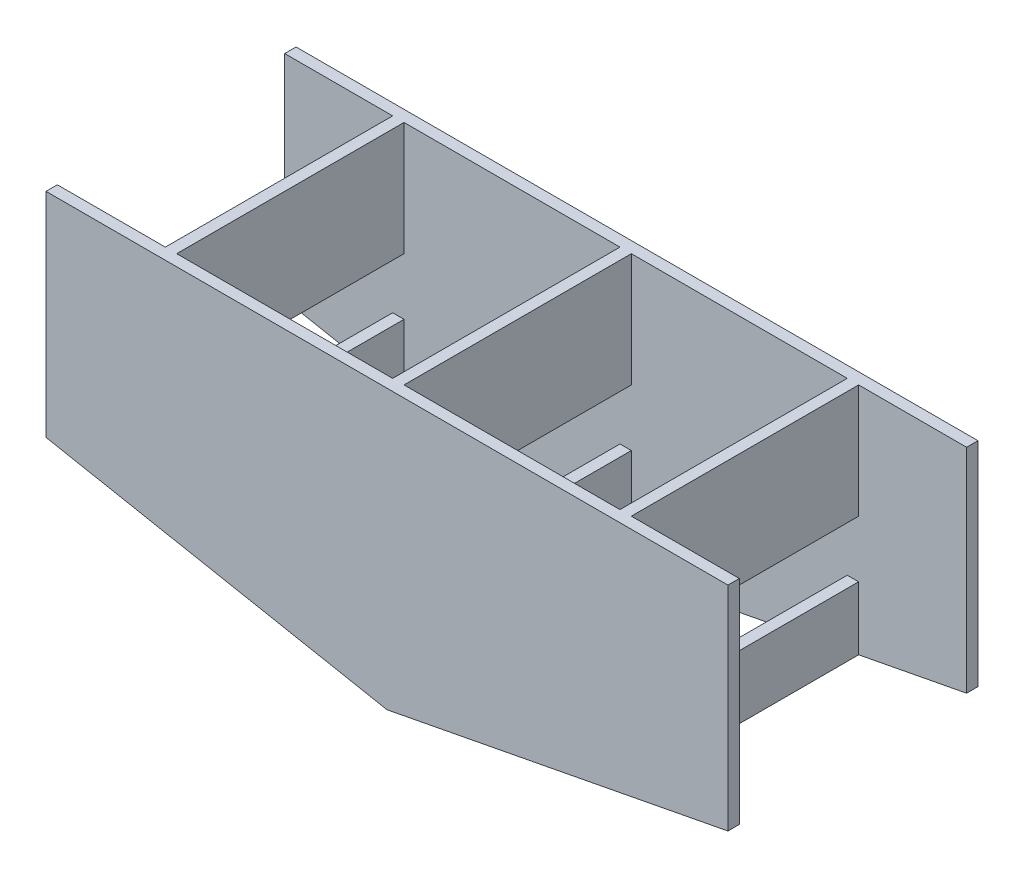
ISO-10303-21;
HEADER;
FILE_DESCRIPTION(('STEP AP214'),'2;1');
FILE_NAME('part.step','',(''),(''),'','','');
FILE_SCHEMA(('AUTOMOTIVE_DESIGN { 1 0 10303 214 1 1 1 1 }'));
ENDSEC;
DATA;
#1=APPLICATION_CONTEXT('core data for automotive mechanical design processes');
#2=APPLICATION_PROTOCOL_DEFINITION('international standard','automotive_design',2000,#1);
#3=PRODUCT_CONTEXT('',#1,'mechanical');
#4=PRODUCT('Part','Part','',(#3));
#5=PRODUCT_RELATED_PRODUCT_CATEGORY('part','',(#4));
#6=PRODUCT_DEFINITION_FORMATION('','',#4);
#7=PRODUCT_DEFINITION_CONTEXT('part definition',#1,'design');
#8=PRODUCT_DEFINITION('design','',#6,#7);
#9=PRODUCT_DEFINITION_SHAPE('','',#8);
#10=(LENGTH_UNIT() NAMED_UNIT(*) SI_UNIT(.MILLI.,.METRE.));
#11=(NAMED_UNIT(*) PLANE_ANGLE_UNIT() SI_UNIT($,.RADIAN.));
#12=(NAMED_UNIT(*) SI_UNIT($,.STERADIAN.) SOLID_ANGLE_UNIT());
#13=UNCERTAINTY_MEASURE_WITH_UNIT(LENGTH_MEASURE(1.E-05),#10,'distance_accuracy_value','');
#14=(GEOMETRIC_REPRESENTATION_CONTEXT(3) GLOBAL_UNCERTAINTY_ASSIGNED_CONTEXT((#13)) GLOBAL_UNIT_ASSIGNED_CONTEXT((#10,
#11,#12)) REPRESENTATION_CONTEXT('',''));
#15=CARTESIAN_POINT('',(0.,0.,0.));
#16=DIRECTION('',(0.,0.,1.));
#17=DIRECTION('',(1.,0.,0.));
#18=AXIS2_PLACEMENT_3D('',#15,#16,#17);
#19=CARTESIAN_POINT('',(152.4,-32.976439839216,-111.76));
#20=DIRECTION('',(1.,0.,0.));
#21=DIRECTION('',(0.,0.,-1.));
#22=AXIS2_PLACEMENT_3D('',#19,#20,#21);
#23=PLANE('',#22);
#24=DIRECTION('',(0.,1.,0.));
#25=VECTOR('',#24,1.);
#26=CARTESIAN_POINT('',(152.4,11.43,-106.68));
#27=LINE('',#26,#25);
#28=CARTESIAN_POINT('',(152.4,-32.976439839216,-106.68));
#29=VERTEX_POINT('',#28);
#30=CARTESIAN_POINT('',(152.4,62.23,-106.68));
#31=VERTEX_POINT('',#30);
#32=EDGE_CURVE('E374',#29,#31,#27,.T.);
#33=ORIENTED_EDGE('',*,*,#32,.F.);
#34=DIRECTION('',(0.,0.,1.));
#35=VECTOR('',#34,1.);
#36=CARTESIAN_POINT('',(152.4,-32.976439839216,-111.76));
#37=LINE('',#36,#35);
#38=CARTESIAN_POINT('',(152.4,-32.976439839216,-111.76));
#39=VERTEX_POINT('',#38);
#40=EDGE_CURVE('E424',#39,#29,#37,.T.);
#41=ORIENTED_EDGE('',*,*,#40,.F.);
#42=DIRECTION('',(0.,1.,0.));
#43=VECTOR('',#42,1.);
#44=CARTESIAN_POINT('',(152.4,-32.976439839216,-111.76));
#45=LINE('',#44,#43);
#46=CARTESIAN_POINT('',(152.4,62.23,-111.76));
#47=VERTEX_POINT('',#46);
#48=EDGE_CURVE('E406',#39,#47,#45,.T.);
#49=ORIENTED_EDGE('',*,*,#48,.T.);
#50=DIRECTION('',(0.,0.,1.));
#51=VECTOR('',#50,1.);
#52=CARTESIAN_POINT('',(152.4,62.23,-111.76));
#53=LINE('',#52,#51);
#54=EDGE_CURVE('E11',#47,#31,#53,.T.);
#55=ORIENTED_EDGE('',*,*,#54,.T.);
#56=EDGE_LOOP('',(#33,#41,#49,#55));
#57=FACE_BOUND('',#56,.T.);
#58=ADVANCED_FACE('F32',(#57),#23,.T.);
#59=CARTESIAN_POINT('',(-152.4,62.23,-111.76));
#60=DIRECTION('',(-1.,0.,0.));
#61=DIRECTION('',(0.,0.,1.));
#62=AXIS2_PLACEMENT_3D('',#59,#60,#61);
#63=PLANE('',#62);
#64=DIRECTION('',(0.,-1.,0.));
#65=VECTOR('',#64,1.);
#66=CARTESIAN_POINT('',(-152.4,11.43,-5.08));
#67=LINE('',#66,#65);
#68=CARTESIAN_POINT('',(-152.4,62.23,-5.07999999999999));
#69=VERTEX_POINT('',#68);
#70=CARTESIAN_POINT('',(-152.4,-33.02,-5.07999999999999));
#71=VERTEX_POINT('',#70);
#72=EDGE_CURVE('E365',#69,#71,#67,.T.);
#73=ORIENTED_EDGE('',*,*,#72,.T.);
#74=DIRECTION('',(0.,0.,1.));
#75=VECTOR('',#74,1.);
#76=CARTESIAN_POINT('',(-152.4,-33.02,-111.76));
#77=LINE('',#76,#75);
#78=CARTESIAN_POINT('',(-152.4,-33.02,0.));
#79=VERTEX_POINT('',#78);
#80=EDGE_CURVE('E431',#71,#79,#77,.T.);
#81=ORIENTED_EDGE('',*,*,#80,.T.);
#82=DIRECTION('',(0.,-1.,0.));
#83=VECTOR('',#82,1.);
#84=CARTESIAN_POINT('',(-152.4,62.23,0.));
#85=LINE('',#84,#83);
#86=CARTESIAN_POINT('',(-152.4,62.23,0.));
#87=VERTEX_POINT('',#86);
#88=EDGE_CURVE('E413',#87,#79,#85,.T.);
#89=ORIENTED_EDGE('',*,*,#88,.F.);
#90=DIRECTION('',(0.,0.,1.));
#91=VECTOR('',#90,1.);
#92=CARTESIAN_POINT('',(-152.4,62.23,-111.76));
#93=LINE('',#92,#91);
#94=EDGE_CURVE('E409',#69,#87,#93,.T.);
#95=ORIENTED_EDGE('',*,*,#94,.F.);
#96=EDGE_LOOP('',(#73,#81,#89,#95));
#97=FACE_BOUND('',#96,.T.);
#98=ADVANCED_FACE('F447',(#97),#63,.T.);
#99=CARTESIAN_POINT('',(-152.4,11.43,-106.68));
#100=DIRECTION('',(0.,1.,0.));
#101=DIRECTION('',(0.,0.,1.));
#102=AXIS2_PLACEMENT_3D('',#99,#100,#101);
#103=PLANE('',#102);
#104=DIRECTION('',(-1.,0.,0.));
#105=VECTOR('',#104,1.);
#106=CARTESIAN_POINT('',(-152.4,11.43,-106.68));
#107=LINE('',#106,#105);
#108=CARTESIAN_POINT('',(2.54000000000011,11.43,-106.68));
#109=VERTEX_POINT('',#108);
#110=CARTESIAN_POINT('',(-2.54,11.43,-106.68));
#111=VERTEX_POINT('',#110);
#112=EDGE_CURVE('E379',#109,#111,#107,.T.);
#113=ORIENTED_EDGE('',*,*,#112,.F.);
#114=DIRECTION('',(0.,0.,1.));
#115=VECTOR('',#114,1.);
#116=CARTESIAN_POINT('',(2.54000000000013,11.43,-106.68));
#117=LINE('',#116,#115);
#118=CARTESIAN_POINT('',(2.54000000000001,11.43,-5.08));
#119=VERTEX_POINT('',#118);
#120=EDGE_CURVE('E307',#109,#119,#117,.T.);
#121=ORIENTED_EDGE('',*,*,#120,.T.);
#122=DIRECTION('',(-1.,0.,0.));
#123=VECTOR('',#122,1.);
#124=CARTESIAN_POINT('',(-152.4,11.43,-5.08));
#125=LINE('',#124,#123);
#126=CARTESIAN_POINT('',(-2.54,11.43,-5.08));
#127=VERTEX_POINT('',#126);
#128=EDGE_CURVE('E392',#119,#127,#125,.T.);
#129=ORIENTED_EDGE('',*,*,#128,.T.);
#130=DIRECTION('',(0.,0.,-1.));
#131=VECTOR('',#130,1.);
#132=CARTESIAN_POINT('',(-2.54000000000001,11.43,-106.68));
#133=LINE('',#132,#131);
#134=EDGE_CURVE('E286',#127,#111,#133,.T.);
#135=ORIENTED_EDGE('',*,*,#134,.T.);
#136=EDGE_LOOP('',(#113,#121,#129,#135));
#137=FACE_BOUND('',#136,.T.);
#138=ADVANCED_FACE('F560',(#137),#103,.F.);
#139=CARTESIAN_POINT('',(104.14,11.43,-106.68));
#140=VERTEX_POINT('',#139);
#141=CARTESIAN_POINT('',(99.0600000000001,11.43,-106.68));
#142=VERTEX_POINT('',#141);
#143=EDGE_CURVE('E380',#140,#142,#107,.T.);
#144=ORIENTED_EDGE('',*,*,#143,.F.);
#145=DIRECTION('',(0.,0.,1.));
#146=VECTOR('',#145,1.);
#147=CARTESIAN_POINT('',(104.14,11.43,-106.68));
#148=LINE('',#147,#146);
#149=CARTESIAN_POINT('',(104.14,11.43,-5.07999999999989));
#150=VERTEX_POINT('',#149);
#151=EDGE_CURVE('E327',#140,#150,#148,.T.);
#152=ORIENTED_EDGE('',*,*,#151,.T.);
#153=CARTESIAN_POINT('',(99.0599999999999,11.43,-5.08));
#154=VERTEX_POINT('',#153);
#155=EDGE_CURVE('E369',#150,#154,#125,.T.);
#156=ORIENTED_EDGE('',*,*,#155,.T.);
#157=DIRECTION('',(0.,0.,-1.));
#158=VECTOR('',#157,1.);
#159=CARTESIAN_POINT('',(99.0600000000001,11.43,-106.68));
#160=LINE('',#159,#158);
#161=EDGE_CURVE('E296',#154,#142,#160,.T.);
#162=ORIENTED_EDGE('',*,*,#161,.T.);
#163=EDGE_LOOP('',(#144,#152,#156,#162));
#164=FACE_BOUND('',#163,.T.);
#165=ADVANCED_FACE('F555',(#164),#103,.F.);
#166=CARTESIAN_POINT('',(-152.4,-13.97,-106.68));
#167=DIRECTION('',(0.,-1.,0.));
#168=DIRECTION('',(0.,0.,-1.));
#169=AXIS2_PLACEMENT_3D('',#166,#167,#168);
#170=PLANE('',#169);
#171=DIRECTION('',(1.,0.,0.));
#172=VECTOR('',#171,1.);
#173=CARTESIAN_POINT('',(-152.4,-13.97,-5.08));
#174=LINE('',#173,#172);
#175=CARTESIAN_POINT('',(-2.54,-13.97,-5.08));
#176=VERTEX_POINT('',#175);
#177=CARTESIAN_POINT('',(2.53999999999996,-13.97,-5.08));
#178=VERTEX_POINT('',#177);
#179=EDGE_CURVE('E385',#176,#178,#174,.T.);
#180=ORIENTED_EDGE('',*,*,#179,.T.);
#181=DIRECTION('',(0.,0.,-1.));
#182=VECTOR('',#181,1.);
#183=CARTESIAN_POINT('',(2.54000000000013,-13.97,-106.68));
#184=LINE('',#183,#182);
#185=CARTESIAN_POINT('',(2.54000000000011,-13.97,-106.68));
#186=VERTEX_POINT('',#185);
#187=EDGE_CURVE('E304',#178,#186,#184,.T.);
#188=ORIENTED_EDGE('',*,*,#187,.T.);
#189=DIRECTION('',(1.,0.,0.));
#190=VECTOR('',#189,1.);
#191=CARTESIAN_POINT('',(-152.4,-13.97,-106.68));
#192=LINE('',#191,#190);
#193=CARTESIAN_POINT('',(-2.54000000000007,-13.97,-106.68));
#194=VERTEX_POINT('',#193);
#195=EDGE_CURVE('E372',#194,#186,#192,.T.);
#196=ORIENTED_EDGE('',*,*,#195,.F.);
#197=DIRECTION('',(0.,0.,1.));
#198=VECTOR('',#197,1.);
#199=CARTESIAN_POINT('',(-2.54000000000001,-13.97,-106.68));
#200=LINE('',#199,#198);
#201=EDGE_CURVE('E278',#194,#176,#200,.T.);
#202=ORIENTED_EDGE('',*,*,#201,.T.);
#203=EDGE_LOOP('',(#180,#188,#196,#202));
#204=FACE_BOUND('',#203,.T.);
#205=ADVANCED_FACE('F488',(#204),#170,.F.);
#206=CARTESIAN_POINT('',(99.06,-13.97,-5.07999999999989));
#207=VERTEX_POINT('',#206);
#208=CARTESIAN_POINT('',(104.14,-13.97,-5.08));
#209=VERTEX_POINT('',#208);
#210=EDGE_CURVE('E382',#207,#209,#174,.T.);
#211=ORIENTED_EDGE('',*,*,#210,.T.);
#212=DIRECTION('',(0.,0.,-1.));
#213=VECTOR('',#212,1.);
#214=CARTESIAN_POINT('',(104.14,-13.97,-106.68));
#215=LINE('',#214,#213);
#216=CARTESIAN_POINT('',(104.14,-13.97,-106.68));
#217=VERTEX_POINT('',#216);
#218=EDGE_CURVE('E324',#209,#217,#215,.T.);
#219=ORIENTED_EDGE('',*,*,#218,.T.);
#220=CARTESIAN_POINT('',(99.0600000000001,-13.97,-106.68));
#221=VERTEX_POINT('',#220);
#222=EDGE_CURVE('E368',#221,#217,#192,.T.);
#223=ORIENTED_EDGE('',*,*,#222,.F.);
#224=DIRECTION('',(0.,0.,1.));
#225=VECTOR('',#224,1.);
#226=CARTESIAN_POINT('',(99.0600000000001,-13.97,-106.68));
#227=LINE('',#226,#225);
#228=EDGE_CURVE('E293',#221,#207,#227,.T.);
#229=ORIENTED_EDGE('',*,*,#228,.T.);
#230=EDGE_LOOP('',(#211,#219,#223,#229));
#231=FACE_BOUND('',#230,.T.);
#232=ADVANCED_FACE('F520',(#231),#170,.F.);
#233=DIRECTION('',(0.,1.,0.));
#234=VECTOR('',#233,1.);
#235=CARTESIAN_POINT('',(152.4,11.43,-5.08));
#236=LINE('',#235,#234);
#237=CARTESIAN_POINT('',(152.4,-32.976439839216,-5.07999999999984));
#238=VERTEX_POINT('',#237);
#239=CARTESIAN_POINT('',(152.4,62.23,-5.07999999999984));
#240=VERTEX_POINT('',#239);
#241=EDGE_CURVE('E387',#238,#240,#236,.T.);
#242=ORIENTED_EDGE('',*,*,#241,.T.);
#243=CARTESIAN_POINT('',(152.4,62.23,0.));
#244=VERTEX_POINT('',#243);
#245=EDGE_CURVE('E41',#240,#244,#53,.T.);
#246=ORIENTED_EDGE('',*,*,#245,.T.);
#247=DIRECTION('',(0.,1.,0.));
#248=VECTOR('',#247,1.);
#249=CARTESIAN_POINT('',(152.4,-32.976439839216,0.));
#250=LINE('',#249,#248);
#251=CARTESIAN_POINT('',(152.4,-32.976439839216,0.));
#252=VERTEX_POINT('',#251);
#253=EDGE_CURVE('E397',#252,#244,#250,.T.);
#254=ORIENTED_EDGE('',*,*,#253,.F.);
#255=EDGE_CURVE('E427',#238,#252,#37,.T.);
#256=ORIENTED_EDGE('',*,*,#255,.F.);
#257=EDGE_LOOP('',(#242,#246,#254,#256));
#258=FACE_BOUND('',#257,.T.);
#259=ADVANCED_FACE('F454',(#258),#23,.T.);
#260=DIRECTION('',(0.,-1.,0.));
#261=VECTOR('',#260,1.);
#262=CARTESIAN_POINT('',(-152.4,11.43,-106.68));
#263=LINE('',#262,#261);
#264=CARTESIAN_POINT('',(-152.4,62.23,-106.68));
#265=VERTEX_POINT('',#264);
#266=CARTESIAN_POINT('',(-152.4,-33.02,-106.68));
#267=VERTEX_POINT('',#266);
#268=EDGE_CURVE('E366',#265,#267,#263,.T.);
#269=ORIENTED_EDGE('',*,*,#268,.F.);
#270=CARTESIAN_POINT('',(-152.4,62.23,-111.76));
#271=VERTEX_POINT('',#270);
#272=EDGE_CURVE('E36',#271,#265,#93,.T.);
#273=ORIENTED_EDGE('',*,*,#272,.F.);
#274=DIRECTION('',(0.,-1.,0.));
#275=VECTOR('',#274,1.);
#276=CARTESIAN_POINT('',(-152.4,62.23,-111.76));
#277=LINE('',#276,#275);
#278=CARTESIAN_POINT('',(-152.4,-33.02,-111.76));
#279=VERTEX_POINT('',#278);
#280=EDGE_CURVE('E396',#271,#279,#277,.T.);
#281=ORIENTED_EDGE('',*,*,#280,.T.);
#282=EDGE_CURVE('E429',#279,#267,#77,.T.);
#283=ORIENTED_EDGE('',*,*,#282,.T.);
#284=EDGE_LOOP('',(#269,#273,#281,#283));
#285=FACE_BOUND('',#284,.T.);
#286=ADVANCED_FACE('F586',(#285),#63,.T.);
#287=CARTESIAN_POINT('',(152.4,62.23,-111.76));
#288=DIRECTION('',(0.,1.,0.));
#289=DIRECTION('',(0.,0.,1.));
#290=AXIS2_PLACEMENT_3D('',#287,#288,#289);
#291=PLANE('',#290);
#292=DIRECTION('',(-1.,0.,0.));
#293=VECTOR('',#292,1.);
#294=CARTESIAN_POINT('',(152.4,62.23,-106.68));
#295=LINE('',#294,#293);
#296=CARTESIAN_POINT('',(104.14,62.23,-106.68));
#297=VERTEX_POINT('',#296);
#298=EDGE_CURVE('E363',#31,#297,#295,.T.);
#299=ORIENTED_EDGE('',*,*,#298,.F.);
#300=ORIENTED_EDGE('',*,*,#54,.F.);
#301=DIRECTION('',(-1.,0.,0.));
#302=VECTOR('',#301,1.);
#303=CARTESIAN_POINT('',(152.4,62.23,-111.76));
#304=LINE('',#303,#302);
#305=EDGE_CURVE('E393',#47,#271,#304,.T.);
#306=ORIENTED_EDGE('',*,*,#305,.T.);
#307=ORIENTED_EDGE('',*,*,#272,.T.);
#308=DIRECTION('',(-1.,0.,0.));
#309=VECTOR('',#308,1.);
#310=CARTESIAN_POINT('',(152.4,62.23,-106.68));
#311=LINE('',#310,#309);
#312=CARTESIAN_POINT('',(-104.14,62.23,-106.68));
#313=VERTEX_POINT('',#312);
#314=EDGE_CURVE('E347',#313,#265,#311,.T.);
#315=ORIENTED_EDGE('',*,*,#314,.F.);
#316=DIRECTION('',(0.,0.,-1.));
#317=VECTOR('',#316,1.);
#318=CARTESIAN_POINT('',(-104.14,62.23,-111.76));
#319=LINE('',#318,#317);
#320=CARTESIAN_POINT('',(-104.14,62.23,-5.07999999999999));
#321=VERTEX_POINT('',#320);
#322=EDGE_CURVE('E322',#321,#313,#319,.T.);
#323=ORIENTED_EDGE('',*,*,#322,.F.);
#324=DIRECTION('',(1.,0.,0.));
#325=VECTOR('',#324,1.);
#326=CARTESIAN_POINT('',(152.4,62.23,-5.08000000000002));
#327=LINE('',#326,#325);
#328=EDGE_CURVE('E353',#69,#321,#327,.T.);
#329=ORIENTED_EDGE('',*,*,#328,.F.);
#330=ORIENTED_EDGE('',*,*,#94,.T.);
#331=DIRECTION('',(-1.,0.,0.));
#332=VECTOR('',#331,1.);
#333=CARTESIAN_POINT('',(152.4,62.23,0.));
#334=LINE('',#333,#332);
#335=EDGE_CURVE('E410',#244,#87,#334,.T.);
#336=ORIENTED_EDGE('',*,*,#335,.F.);
#337=ORIENTED_EDGE('',*,*,#245,.F.);
#338=DIRECTION('',(1.,0.,0.));
#339=VECTOR('',#338,1.);
#340=CARTESIAN_POINT('',(152.4,62.23,-5.07999999999983));
#341=LINE('',#340,#339);
#342=CARTESIAN_POINT('',(104.14,62.23,-5.07999999999989));
#343=VERTEX_POINT('',#342);
#344=EDGE_CURVE('E357',#343,#240,#341,.T.);
#345=ORIENTED_EDGE('',*,*,#344,.F.);
#346=DIRECTION('',(0.,0.,1.));
#347=VECTOR('',#346,1.);
#348=CARTESIAN_POINT('',(104.14,62.23,-111.76));
#349=LINE('',#348,#347);
#350=EDGE_CURVE('E332',#297,#343,#349,.T.);
#351=ORIENTED_EDGE('',*,*,#350,.F.);
#352=EDGE_LOOP('',(#299,#300,#306,#307,#315,#323,#329,#330,#336,#337,#345,#351));
#353=FACE_BOUND('',#352,.T.);
#354=DIRECTION('',(0.,0.,1.));
#355=VECTOR('',#354,1.);
#356=CARTESIAN_POINT('',(2.54000000000013,62.23,-111.76));
#357=LINE('',#356,#355);
#358=CARTESIAN_POINT('',(2.54000000000011,62.23,-106.68));
#359=VERTEX_POINT('',#358);
#360=CARTESIAN_POINT('',(2.54000000000001,62.23,-5.08));
#361=VERTEX_POINT('',#360);
#362=EDGE_CURVE('E312',#359,#361,#357,.T.);
#363=ORIENTED_EDGE('',*,*,#362,.F.);
#364=DIRECTION('',(-1.,0.,0.));
#365=VECTOR('',#364,1.);
#366=CARTESIAN_POINT('',(152.4,62.23,-106.68));
#367=LINE('',#366,#365);
#368=CARTESIAN_POINT('',(99.0600000000001,62.23,-106.68));
#369=VERTEX_POINT('',#368);
#370=EDGE_CURVE('E343',#369,#359,#367,.T.);
#371=ORIENTED_EDGE('',*,*,#370,.F.);
#372=DIRECTION('',(0.,0.,-1.));
#373=VECTOR('',#372,1.);
#374=CARTESIAN_POINT('',(99.0600000000001,62.23,-111.76));
#375=LINE('',#374,#373);
#376=CARTESIAN_POINT('',(99.06,62.23,-5.07999999999989));
#377=VERTEX_POINT('',#376);
#378=EDGE_CURVE('E302',#377,#369,#375,.T.);
#379=ORIENTED_EDGE('',*,*,#378,.F.);
#380=DIRECTION('',(1.,0.,0.));
#381=VECTOR('',#380,1.);
#382=CARTESIAN_POINT('',(152.4,62.23,-5.07999999999983));
#383=LINE('',#382,#381);
#384=EDGE_CURVE('E339',#361,#377,#383,.T.);
#385=ORIENTED_EDGE('',*,*,#384,.F.);
#386=EDGE_LOOP('',(#363,#371,#379,#385));
#387=FACE_BOUND('',#386,.T.);
#388=DIRECTION('',(0.,0.,-1.));
#389=VECTOR('',#388,1.);
#390=CARTESIAN_POINT('',(-2.54000000000001,62.23,-111.76));
#391=LINE('',#390,#389);
#392=CARTESIAN_POINT('',(-2.54,62.23,-5.08));
#393=VERTEX_POINT('',#392);
#394=CARTESIAN_POINT('',(-2.54000000000001,62.23,-106.68));
#395=VERTEX_POINT('',#394);
#396=EDGE_CURVE('E291',#393,#395,#391,.T.);
#397=ORIENTED_EDGE('',*,*,#396,.F.);
#398=DIRECTION('',(1.,0.,0.));
#399=VECTOR('',#398,1.);
#400=CARTESIAN_POINT('',(152.4,62.23,-5.08000000000002));
#401=LINE('',#400,#399);
#402=CARTESIAN_POINT('',(-99.06,62.23,-5.07999999999999));
#403=VERTEX_POINT('',#402);
#404=EDGE_CURVE('E260',#403,#393,#401,.T.);
#405=ORIENTED_EDGE('',*,*,#404,.F.);
#406=DIRECTION('',(0.,0.,1.));
#407=VECTOR('',#406,1.);
#408=CARTESIAN_POINT('',(-99.06,62.23,-111.76));
#409=LINE('',#408,#407);
#410=CARTESIAN_POINT('',(-99.06,62.23,-106.68));
#411=VERTEX_POINT('',#410);
#412=EDGE_CURVE('E275',#411,#403,#409,.T.);
#413=ORIENTED_EDGE('',*,*,#412,.F.);
#414=DIRECTION('',(-1.,0.,0.));
#415=VECTOR('',#414,1.);
#416=CARTESIAN_POINT('',(152.4,62.23,-106.68));
#417=LINE('',#416,#415);
#418=EDGE_CURVE('E261',#395,#411,#417,.T.);
#419=ORIENTED_EDGE('',*,*,#418,.F.);
#420=EDGE_LOOP('',(#397,#405,#413,#419));
#421=FACE_BOUND('',#420,.T.);
#422=ADVANCED_FACE('F34',(#353,#387,#421),#291,.T.);
#423=CARTESIAN_POINT('',(0.,-62.23,-111.76));
#424=DIRECTION('',(0.188510993493638,-0.982071079572167,0.));
#425=DIRECTION('',(0.982071079572167,0.188510993493638,0.));
#426=AXIS2_PLACEMENT_3D('',#423,#424,#425);
#427=PLANE('',#426);
#428=DIRECTION('',(0.982071079572167,0.188510993493638,0.));
#429=VECTOR('',#428,1.);
#430=CARTESIAN_POINT('',(0.,-62.23,-106.68));
#431=LINE('',#430,#429);
#432=CARTESIAN_POINT('',(104.14,-42.2400672234642,-106.68));
#433=VERTEX_POINT('',#432);
#434=EDGE_CURVE('E360',#433,#29,#431,.T.);
#435=ORIENTED_EDGE('',*,*,#434,.F.);
#436=DIRECTION('',(0.,0.,-1.));
#437=VECTOR('',#436,1.);
#438=CARTESIAN_POINT('',(104.14,-42.2400672234642,-111.76));
#439=LINE('',#438,#437);
#440=CARTESIAN_POINT('',(104.14,-42.2400672234643,-5.07999999999989));
#441=VERTEX_POINT('',#440);
#442=EDGE_CURVE('E330',#441,#433,#439,.T.);
#443=ORIENTED_EDGE('',*,*,#442,.F.);
#444=DIRECTION('',(-0.982071079572167,-0.188510993493638,0.));
#445=VECTOR('',#444,1.);
#446=CARTESIAN_POINT('',(-1.68311808060897E-13,-62.23,-5.08));
#447=LINE('',#446,#445);
#448=EDGE_CURVE('E355',#238,#441,#447,.T.);
#449=ORIENTED_EDGE('',*,*,#448,.F.);
#450=ORIENTED_EDGE('',*,*,#255,.T.);
#451=DIRECTION('',(0.982071079572167,0.188510993493638,0.));
#452=VECTOR('',#451,1.);
#453=CARTESIAN_POINT('',(0.,-62.23,0.));
#454=LINE('',#453,#452);
#455=CARTESIAN_POINT('',(0.,-62.23,0.));
#456=VERTEX_POINT('',#455);
#457=EDGE_CURVE('E419',#456,#252,#454,.T.);
#458=ORIENTED_EDGE('',*,*,#457,.F.);
#459=DIRECTION('',(0.,0.,1.));
#460=VECTOR('',#459,1.);
#461=CARTESIAN_POINT('',(0.,-62.23,-111.76));
#462=LINE('',#461,#460);
#463=CARTESIAN_POINT('',(0.,-62.23,-111.76));
#464=VERTEX_POINT('',#463);
#465=EDGE_CURVE('E428',#464,#456,#462,.T.);
#466=ORIENTED_EDGE('',*,*,#465,.F.);
#467=DIRECTION('',(0.982071079572167,0.188510993493638,0.));
#468=VECTOR('',#467,1.);
#469=CARTESIAN_POINT('',(0.,-62.23,-111.76));
#470=LINE('',#469,#468);
#471=EDGE_CURVE('E403',#464,#39,#470,.T.);
#472=ORIENTED_EDGE('',*,*,#471,.T.);
#473=ORIENTED_EDGE('',*,*,#40,.T.);
#474=EDGE_LOOP('',(#435,#443,#449,#450,#458,#466,#472,#473));
#475=FACE_BOUND('',#474,.T.);
#476=DIRECTION('',(0.,0.,-1.));
#477=VECTOR('',#476,1.);
#478=CARTESIAN_POINT('',(2.54000000000011,-61.7424406639869,-111.76));
#479=LINE('',#478,#477);
#480=CARTESIAN_POINT('',(2.54000000000001,-61.7424406639869,-5.08));
#481=VERTEX_POINT('',#480);
#482=CARTESIAN_POINT('',(2.54000000000011,-61.7424406639869,-106.68));
#483=VERTEX_POINT('',#482);
#484=EDGE_CURVE('E310',#481,#483,#479,.T.);
#485=ORIENTED_EDGE('',*,*,#484,.F.);
#486=DIRECTION('',(-0.982071079572167,-0.188510993493638,0.));
#487=VECTOR('',#486,1.);
#488=CARTESIAN_POINT('',(-1.72010190252032E-13,-62.23,-5.08));
#489=LINE('',#488,#487);
#490=CARTESIAN_POINT('',(99.06,-43.2151858954904,-5.07999999999989));
#491=VERTEX_POINT('',#490);
#492=EDGE_CURVE('E337',#491,#481,#489,.T.);
#493=ORIENTED_EDGE('',*,*,#492,.F.);
#494=DIRECTION('',(0.,0.,1.));
#495=VECTOR('',#494,1.);
#496=CARTESIAN_POINT('',(99.0600000000001,-43.2151858954904,-111.76));
#497=LINE('',#496,#495);
#498=CARTESIAN_POINT('',(99.0600000000001,-43.2151858954904,-106.68));
#499=VERTEX_POINT('',#498);
#500=EDGE_CURVE('E299',#499,#491,#497,.T.);
#501=ORIENTED_EDGE('',*,*,#500,.F.);
#502=DIRECTION('',(0.982071079572167,0.188510993493638,0.));
#503=VECTOR('',#502,1.);
#504=CARTESIAN_POINT('',(0.,-62.23,-106.68));
#505=LINE('',#504,#503);
#506=EDGE_CURVE('E341',#483,#499,#505,.T.);
#507=ORIENTED_EDGE('',*,*,#506,.F.);
#508=EDGE_LOOP('',(#485,#493,#501,#507));
#509=FACE_BOUND('',#508,.T.);
#510=ADVANCED_FACE('F508',(#475,#509),#427,.T.);
#511=CARTESIAN_POINT('',(-152.4,-33.02,-111.76));
#512=DIRECTION('',(-0.188240243952682,-0.982123011927037,0.));
#513=DIRECTION('',(0.982123011927037,-0.188240243952682,0.));
#514=AXIS2_PLACEMENT_3D('',#511,#512,#513);
#515=PLANE('',#514);
#516=DIRECTION('',(-0.982123011927037,0.188240243952682,0.));
#517=VECTOR('',#516,1.);
#518=CARTESIAN_POINT('',(-152.4,-33.02,-5.07999999999999));
#519=LINE('',#518,#517);
#520=CARTESIAN_POINT('',(-104.14,-42.2698333333333,-5.07999999999999));
#521=VERTEX_POINT('',#520);
#522=EDGE_CURVE('E350',#521,#71,#519,.T.);
#523=ORIENTED_EDGE('',*,*,#522,.F.);
#524=DIRECTION('',(0.,0.,1.));
#525=VECTOR('',#524,1.);
#526=CARTESIAN_POINT('',(-104.14,-42.2698333333333,-111.76));
#527=LINE('',#526,#525);
#528=CARTESIAN_POINT('',(-104.14,-42.2698333333333,-106.68));
#529=VERTEX_POINT('',#528);
#530=EDGE_CURVE('E320',#529,#521,#527,.T.);
#531=ORIENTED_EDGE('',*,*,#530,.F.);
#532=DIRECTION('',(0.982123011927037,-0.188240243952682,0.));
#533=VECTOR('',#532,1.);
#534=CARTESIAN_POINT('',(-152.4,-33.02,-106.68));
#535=LINE('',#534,#533);
#536=EDGE_CURVE('E345',#267,#529,#535,.T.);
#537=ORIENTED_EDGE('',*,*,#536,.F.);
#538=ORIENTED_EDGE('',*,*,#282,.F.);
#539=DIRECTION('',(0.982123011927037,-0.188240243952682,0.));
#540=VECTOR('',#539,1.);
#541=CARTESIAN_POINT('',(-152.4,-33.02,-111.76));
#542=LINE('',#541,#540);
#543=EDGE_CURVE('E400',#279,#464,#542,.T.);
#544=ORIENTED_EDGE('',*,*,#543,.T.);
#545=ORIENTED_EDGE('',*,*,#465,.T.);
#546=DIRECTION('',(0.982123011927037,-0.188240243952682,0.));
#547=VECTOR('',#546,1.);
#548=CARTESIAN_POINT('',(-152.4,-33.02,0.));
#549=LINE('',#548,#547);
#550=EDGE_CURVE('E416',#79,#456,#549,.T.);
#551=ORIENTED_EDGE('',*,*,#550,.F.);
#552=ORIENTED_EDGE('',*,*,#80,.F.);
#553=EDGE_LOOP('',(#523,#531,#537,#538,#544,#545,#551,#552));
#554=FACE_BOUND('',#553,.T.);
#555=DIRECTION('',(0.,0.,1.));
#556=VECTOR('',#555,1.);
#557=CARTESIAN_POINT('',(-2.54000000000004,-61.7431666666667,-111.76));
#558=LINE('',#557,#556);
#559=CARTESIAN_POINT('',(-2.53999999999998,-61.7431666666667,-106.68));
#560=VERTEX_POINT('',#559);
#561=CARTESIAN_POINT('',(-2.53999999999998,-61.7431666666667,-5.08));
#562=VERTEX_POINT('',#561);
#563=EDGE_CURVE('E289',#560,#562,#558,.T.);
#564=ORIENTED_EDGE('',*,*,#563,.F.);
#565=DIRECTION('',(0.982123011927037,-0.188240243952682,0.));
#566=VECTOR('',#565,1.);
#567=CARTESIAN_POINT('',(-152.4,-33.02,-106.68));
#568=LINE('',#567,#566);
#569=CARTESIAN_POINT('',(-99.06,-43.2435,-106.68));
#570=VERTEX_POINT('',#569);
#571=EDGE_CURVE('E274',#570,#560,#568,.T.);
#572=ORIENTED_EDGE('',*,*,#571,.F.);
#573=DIRECTION('',(0.,0.,-1.));
#574=VECTOR('',#573,1.);
#575=CARTESIAN_POINT('',(-99.06,-43.2435,-111.76));
#576=LINE('',#575,#574);
#577=CARTESIAN_POINT('',(-99.06,-43.2435,-5.07999999999999));
#578=VERTEX_POINT('',#577);
#579=EDGE_CURVE('E266',#578,#570,#576,.T.);
#580=ORIENTED_EDGE('',*,*,#579,.F.);
#581=DIRECTION('',(-0.982123011927037,0.188240243952682,0.));
#582=VECTOR('',#581,1.);
#583=CARTESIAN_POINT('',(-152.4,-33.02,-5.07999999999999));
#584=LINE('',#583,#582);
#585=EDGE_CURVE('E249',#562,#578,#584,.T.);
#586=ORIENTED_EDGE('',*,*,#585,.F.);
#587=EDGE_LOOP('',(#564,#572,#580,#586));
#588=FACE_BOUND('',#587,.T.);
#589=ADVANCED_FACE('F273',(#554,#588),#515,.T.);
#590=CARTESIAN_POINT('',(0.,0.,-111.76));
#591=DIRECTION('',(0.,0.,1.));
#592=DIRECTION('',(1.,0.,0.));
#593=AXIS2_PLACEMENT_3D('',#590,#591,#592);
#594=PLANE('',#593);
#595=ORIENTED_EDGE('',*,*,#305,.F.);
#596=ORIENTED_EDGE('',*,*,#48,.F.);
#597=ORIENTED_EDGE('',*,*,#471,.F.);
#598=ORIENTED_EDGE('',*,*,#543,.F.);
#599=ORIENTED_EDGE('',*,*,#280,.F.);
#600=EDGE_LOOP('',(#595,#596,#597,#598,#599));
#601=FACE_BOUND('',#600,.T.);
#602=ADVANCED_FACE('F584',(#601),#594,.F.);
#603=CARTESIAN_POINT('',(0.,0.,0.));
#604=DIRECTION('',(0.,0.,1.));
#605=DIRECTION('',(1.,0.,0.));
#606=AXIS2_PLACEMENT_3D('',#603,#604,#605);
#607=PLANE('',#606);
#608=ORIENTED_EDGE('',*,*,#335,.T.);
#609=ORIENTED_EDGE('',*,*,#88,.T.);
#610=ORIENTED_EDGE('',*,*,#550,.T.);
#611=ORIENTED_EDGE('',*,*,#457,.T.);
#612=ORIENTED_EDGE('',*,*,#253,.T.);
#613=EDGE_LOOP('',(#608,#609,#610,#611,#612));
#614=FACE_BOUND('',#613,.T.);
#615=ADVANCED_FACE('F449',(#614),#607,.T.);
#616=CARTESIAN_POINT('',(-99.06,11.43,-5.07999999999999));
#617=VERTEX_POINT('',#616);
#618=CARTESIAN_POINT('',(-104.14,11.43,-5.07999999999999));
#619=VERTEX_POINT('',#618);
#620=EDGE_CURVE('E389',#617,#619,#125,.T.);
#621=ORIENTED_EDGE('',*,*,#620,.T.);
#622=DIRECTION('',(0.,0.,-1.));
#623=VECTOR('',#622,1.);
#624=CARTESIAN_POINT('',(-104.14,11.43,-106.68));
#625=LINE('',#624,#623);
#626=CARTESIAN_POINT('',(-104.14,11.43,-106.68));
#627=VERTEX_POINT('',#626);
#628=EDGE_CURVE('E317',#619,#627,#625,.T.);
#629=ORIENTED_EDGE('',*,*,#628,.T.);
#630=CARTESIAN_POINT('',(-99.06,11.43,-106.68));
#631=VERTEX_POINT('',#630);
#632=EDGE_CURVE('E376',#631,#627,#107,.T.);
#633=ORIENTED_EDGE('',*,*,#632,.F.);
#634=DIRECTION('',(0.,0.,1.));
#635=VECTOR('',#634,1.);
#636=CARTESIAN_POINT('',(-99.06,11.43,-106.68));
#637=LINE('',#636,#635);
#638=EDGE_CURVE('E276',#631,#617,#637,.T.);
#639=ORIENTED_EDGE('',*,*,#638,.T.);
#640=EDGE_LOOP('',(#621,#629,#633,#639));
#641=FACE_BOUND('',#640,.T.);
#642=ADVANCED_FACE('F576',(#641),#103,.F.);
#643=CARTESIAN_POINT('',(-104.14,-13.97,-106.68));
#644=VERTEX_POINT('',#643);
#645=CARTESIAN_POINT('',(-99.06,-13.97,-106.68));
#646=VERTEX_POINT('',#645);
#647=EDGE_CURVE('E373',#644,#646,#192,.T.);
#648=ORIENTED_EDGE('',*,*,#647,.F.);
#649=DIRECTION('',(0.,0.,1.));
#650=VECTOR('',#649,1.);
#651=CARTESIAN_POINT('',(-104.14,-13.97,-106.68));
#652=LINE('',#651,#650);
#653=CARTESIAN_POINT('',(-104.14,-13.97,-5.07999999999999));
#654=VERTEX_POINT('',#653);
#655=EDGE_CURVE('E314',#644,#654,#652,.T.);
#656=ORIENTED_EDGE('',*,*,#655,.T.);
#657=CARTESIAN_POINT('',(-99.06,-13.97,-5.07999999999999));
#658=VERTEX_POINT('',#657);
#659=EDGE_CURVE('E386',#654,#658,#174,.T.);
#660=ORIENTED_EDGE('',*,*,#659,.T.);
#661=DIRECTION('',(0.,0.,-1.));
#662=VECTOR('',#661,1.);
#663=CARTESIAN_POINT('',(-99.06,-13.97,-106.68));
#664=LINE('',#663,#662);
#665=EDGE_CURVE('E269',#658,#646,#664,.T.);
#666=ORIENTED_EDGE('',*,*,#665,.T.);
#667=EDGE_LOOP('',(#648,#656,#660,#666));
#668=FACE_BOUND('',#667,.T.);
#669=ADVANCED_FACE('F493',(#668),#170,.F.);
#670=CARTESIAN_POINT('',(0.,0.,-106.68));
#671=DIRECTION('',(0.,0.,1.));
#672=DIRECTION('',(1.,0.,0.));
#673=AXIS2_PLACEMENT_3D('',#670,#671,#672);
#674=PLANE('',#673);
#675=ORIENTED_EDGE('',*,*,#632,.T.);
#676=DIRECTION('',(0.,1.,0.));
#677=VECTOR('',#676,1.);
#678=CARTESIAN_POINT('',(-104.14,-62.23,-106.68));
#679=LINE('',#678,#677);
#680=EDGE_CURVE('E547',#627,#313,#679,.T.);
#681=ORIENTED_EDGE('',*,*,#680,.T.);
#682=ORIENTED_EDGE('',*,*,#314,.T.);
#683=ORIENTED_EDGE('',*,*,#268,.T.);
#684=ORIENTED_EDGE('',*,*,#536,.T.);
#685=EDGE_CURVE('E546',#529,#644,#679,.T.);
#686=ORIENTED_EDGE('',*,*,#685,.T.);
#687=ORIENTED_EDGE('',*,*,#647,.T.);
#688=DIRECTION('',(0.,1.,0.));
#689=VECTOR('',#688,1.);
#690=CARTESIAN_POINT('',(-99.06,-62.23,-106.68));
#691=LINE('',#690,#689);
#692=EDGE_CURVE('E472',#570,#646,#691,.T.);
#693=ORIENTED_EDGE('',*,*,#692,.F.);
#694=ORIENTED_EDGE('',*,*,#571,.T.);
#695=DIRECTION('',(0.,1.,0.));
#696=VECTOR('',#695,1.);
#697=CARTESIAN_POINT('',(-2.54,-62.23,-106.68));
#698=LINE('',#697,#696);
#699=EDGE_CURVE('E476',#560,#194,#698,.T.);
#700=ORIENTED_EDGE('',*,*,#699,.T.);
#701=ORIENTED_EDGE('',*,*,#195,.T.);
#702=DIRECTION('',(0.,1.,0.));
#703=VECTOR('',#702,1.);
#704=CARTESIAN_POINT('',(2.54000000000011,-62.23,-106.68));
#705=LINE('',#704,#703);
#706=EDGE_CURVE('E477',#483,#186,#705,.T.);
#707=ORIENTED_EDGE('',*,*,#706,.F.);
#708=ORIENTED_EDGE('',*,*,#506,.T.);
#709=DIRECTION('',(0.,1.,0.));
#710=VECTOR('',#709,1.);
#711=CARTESIAN_POINT('',(99.0600000000001,-62.23,-106.68));
#712=LINE('',#711,#710);
#713=EDGE_CURVE('E531',#499,#221,#712,.T.);
#714=ORIENTED_EDGE('',*,*,#713,.T.);
#715=ORIENTED_EDGE('',*,*,#222,.T.);
#716=DIRECTION('',(0.,1.,0.));
#717=VECTOR('',#716,1.);
#718=CARTESIAN_POINT('',(104.14,-62.23,-106.68));
#719=LINE('',#718,#717);
#720=EDGE_CURVE('E517',#433,#217,#719,.T.);
#721=ORIENTED_EDGE('',*,*,#720,.F.);
#722=ORIENTED_EDGE('',*,*,#434,.T.);
#723=ORIENTED_EDGE('',*,*,#32,.T.);
#724=ORIENTED_EDGE('',*,*,#298,.T.);
#725=EDGE_CURVE('E465',#140,#297,#719,.T.);
#726=ORIENTED_EDGE('',*,*,#725,.F.);
#727=ORIENTED_EDGE('',*,*,#143,.T.);
#728=EDGE_CURVE('E524',#142,#369,#712,.T.);
#729=ORIENTED_EDGE('',*,*,#728,.T.);
#730=ORIENTED_EDGE('',*,*,#370,.T.);
#731=EDGE_CURVE('E538',#109,#359,#705,.T.);
#732=ORIENTED_EDGE('',*,*,#731,.F.);
#733=ORIENTED_EDGE('',*,*,#112,.T.);
#734=EDGE_CURVE('E57',#111,#395,#698,.T.);
#735=ORIENTED_EDGE('',*,*,#734,.T.);
#736=ORIENTED_EDGE('',*,*,#418,.T.);
#737=EDGE_CURVE('E473',#631,#411,#691,.T.);
#738=ORIENTED_EDGE('',*,*,#737,.F.);
#739=EDGE_LOOP('',(#675,#681,#682,#683,#684,#686,#687,#693,#694,#700,#701,#707,#708,#714,#715,
#721,#722,#723,#724,#726,#727,#729,#730,#732,#733,#735,#736,#738));
#740=FACE_BOUND('',#739,.T.);
#741=ADVANCED_FACE('F537',(#740),#674,.T.);
#742=CARTESIAN_POINT('',(0.,0.,-5.08));
#743=DIRECTION('',(0.,0.,1.));
#744=DIRECTION('',(1.,0.,0.));
#745=AXIS2_PLACEMENT_3D('',#742,#743,#744);
#746=PLANE('',#745);
#747=ORIENTED_EDGE('',*,*,#659,.F.);
#748=DIRECTION('',(0.,1.,0.));
#749=VECTOR('',#748,1.);
#750=CARTESIAN_POINT('',(-104.14,-62.23,-5.07999999999999));
#751=LINE('',#750,#749);
#752=EDGE_CURVE('E496',#521,#654,#751,.T.);
#753=ORIENTED_EDGE('',*,*,#752,.F.);
#754=ORIENTED_EDGE('',*,*,#522,.T.);
#755=ORIENTED_EDGE('',*,*,#72,.F.);
#756=ORIENTED_EDGE('',*,*,#328,.T.);
#757=EDGE_CURVE('E499',#619,#321,#751,.T.);
#758=ORIENTED_EDGE('',*,*,#757,.F.);
#759=ORIENTED_EDGE('',*,*,#620,.F.);
#760=DIRECTION('',(0.,1.,0.));
#761=VECTOR('',#760,1.);
#762=CARTESIAN_POINT('',(-99.06,-62.23,-5.07999999999999));
#763=LINE('',#762,#761);
#764=EDGE_CURVE('E271',#617,#403,#763,.T.);
#765=ORIENTED_EDGE('',*,*,#764,.T.);
#766=ORIENTED_EDGE('',*,*,#404,.T.);
#767=DIRECTION('',(0.,1.,0.));
#768=VECTOR('',#767,1.);
#769=CARTESIAN_POINT('',(-2.54,-62.23,-5.08));
#770=LINE('',#769,#768);
#771=EDGE_CURVE('E270',#127,#393,#770,.T.);
#772=ORIENTED_EDGE('',*,*,#771,.F.);
#773=ORIENTED_EDGE('',*,*,#128,.F.);
#774=DIRECTION('',(0.,1.,0.));
#775=VECTOR('',#774,1.);
#776=CARTESIAN_POINT('',(2.54000000000001,-62.23,-5.08));
#777=LINE('',#776,#775);
#778=EDGE_CURVE('E49',#119,#361,#777,.T.);
#779=ORIENTED_EDGE('',*,*,#778,.T.);
#780=ORIENTED_EDGE('',*,*,#384,.T.);
#781=DIRECTION('',(0.,1.,0.));
#782=VECTOR('',#781,1.);
#783=CARTESIAN_POINT('',(99.06,-62.23,-5.07999999999989));
#784=LINE('',#783,#782);
#785=EDGE_CURVE('E525',#154,#377,#784,.T.);
#786=ORIENTED_EDGE('',*,*,#785,.F.);
#787=ORIENTED_EDGE('',*,*,#155,.F.);
#788=DIRECTION('',(0.,1.,0.));
#789=VECTOR('',#788,1.);
#790=CARTESIAN_POINT('',(104.14,-62.23,-5.07999999999989));
#791=LINE('',#790,#789);
#792=EDGE_CURVE('E460',#150,#343,#791,.T.);
#793=ORIENTED_EDGE('',*,*,#792,.T.);
#794=ORIENTED_EDGE('',*,*,#344,.T.);
#795=ORIENTED_EDGE('',*,*,#241,.F.);
#796=ORIENTED_EDGE('',*,*,#448,.T.);
#797=EDGE_CURVE('E463',#441,#209,#791,.T.);
#798=ORIENTED_EDGE('',*,*,#797,.T.);
#799=ORIENTED_EDGE('',*,*,#210,.F.);
#800=EDGE_CURVE('E521',#491,#207,#784,.T.);
#801=ORIENTED_EDGE('',*,*,#800,.F.);
#802=ORIENTED_EDGE('',*,*,#492,.T.);
#803=EDGE_CURVE('E491',#481,#178,#777,.T.);
#804=ORIENTED_EDGE('',*,*,#803,.T.);
#805=ORIENTED_EDGE('',*,*,#179,.F.);
#806=EDGE_CURVE('E256',#562,#176,#770,.T.);
#807=ORIENTED_EDGE('',*,*,#806,.F.);
#808=ORIENTED_EDGE('',*,*,#585,.T.);
#809=EDGE_CURVE('E253',#578,#658,#763,.T.);
#810=ORIENTED_EDGE('',*,*,#809,.T.);
#811=EDGE_LOOP('',(#747,#753,#754,#755,#756,#758,#759,#765,#766,#772,#773,#779,#780,#786,#787,
#793,#794,#795,#796,#798,#799,#801,#802,#804,#805,#807,#808,#810));
#812=FACE_BOUND('',#811,.T.);
#813=ADVANCED_FACE('F252',(#812),#746,.F.);
#814=CARTESIAN_POINT('',(-99.06,-62.23,-5.07999999999999));
#815=DIRECTION('',(-1.,0.,0.));
#816=DIRECTION('',(0.,0.,1.));
#817=AXIS2_PLACEMENT_3D('',#814,#815,#816);
#818=PLANE('',#817);
#819=ORIENTED_EDGE('',*,*,#579,.T.);
#820=ORIENTED_EDGE('',*,*,#692,.T.);
#821=ORIENTED_EDGE('',*,*,#665,.F.);
#822=ORIENTED_EDGE('',*,*,#809,.F.);
#823=EDGE_LOOP('',(#819,#820,#821,#822));
#824=FACE_BOUND('',#823,.T.);
#825=ADVANCED_FACE('F265',(#824),#818,.F.);
#826=CARTESIAN_POINT('',(-2.54,-62.23,-5.08));
#827=DIRECTION('',(1.,0.,0.));
#828=DIRECTION('',(0.,0.,-1.));
#829=AXIS2_PLACEMENT_3D('',#826,#827,#828);
#830=PLANE('',#829);
#831=ORIENTED_EDGE('',*,*,#563,.T.);
#832=ORIENTED_EDGE('',*,*,#806,.T.);
#833=ORIENTED_EDGE('',*,*,#201,.F.);
#834=ORIENTED_EDGE('',*,*,#699,.F.);
#835=EDGE_LOOP('',(#831,#832,#833,#834));
#836=FACE_BOUND('',#835,.T.);
#837=ADVANCED_FACE('F483',(#836),#830,.F.);
#838=CARTESIAN_POINT('',(99.06,-62.23,-5.07999999999989));
#839=DIRECTION('',(1.,0.,0.));
#840=DIRECTION('',(0.,0.,-1.));
#841=AXIS2_PLACEMENT_3D('',#838,#839,#840);
#842=PLANE('',#841);
#843=ORIENTED_EDGE('',*,*,#500,.T.);
#844=ORIENTED_EDGE('',*,*,#800,.T.);
#845=ORIENTED_EDGE('',*,*,#228,.F.);
#846=ORIENTED_EDGE('',*,*,#713,.F.);
#847=EDGE_LOOP('',(#843,#844,#845,#846));
#848=FACE_BOUND('',#847,.T.);
#849=ADVANCED_FACE('F529',(#848),#842,.F.);
#850=CARTESIAN_POINT('',(2.54000000000001,-62.23,-5.08));
#851=DIRECTION('',(-1.,0.,0.));
#852=DIRECTION('',(0.,0.,1.));
#853=AXIS2_PLACEMENT_3D('',#850,#851,#852);
#854=PLANE('',#853);
#855=ORIENTED_EDGE('',*,*,#484,.T.);
#856=ORIENTED_EDGE('',*,*,#706,.T.);
#857=ORIENTED_EDGE('',*,*,#187,.F.);
#858=ORIENTED_EDGE('',*,*,#803,.F.);
#859=EDGE_LOOP('',(#855,#856,#857,#858));
#860=FACE_BOUND('',#859,.T.);
#861=ADVANCED_FACE('F536',(#860),#854,.F.);
#862=CARTESIAN_POINT('',(-104.14,-62.23,-106.68));
#863=DIRECTION('',(1.,0.,0.));
#864=DIRECTION('',(0.,0.,-1.));
#865=AXIS2_PLACEMENT_3D('',#862,#863,#864);
#866=PLANE('',#865);
#867=ORIENTED_EDGE('',*,*,#530,.T.);
#868=ORIENTED_EDGE('',*,*,#752,.T.);
#869=ORIENTED_EDGE('',*,*,#655,.F.);
#870=ORIENTED_EDGE('',*,*,#685,.F.);
#871=EDGE_LOOP('',(#867,#868,#869,#870));
#872=FACE_BOUND('',#871,.T.);
#873=ADVANCED_FACE('F629',(#872),#866,.F.);
#874=CARTESIAN_POINT('',(104.14,-62.23,-106.68));
#875=DIRECTION('',(-1.,0.,0.));
#876=DIRECTION('',(0.,0.,1.));
#877=AXIS2_PLACEMENT_3D('',#874,#875,#876);
#878=PLANE('',#877);
#879=ORIENTED_EDGE('',*,*,#442,.T.);
#880=ORIENTED_EDGE('',*,*,#720,.T.);
#881=ORIENTED_EDGE('',*,*,#218,.F.);
#882=ORIENTED_EDGE('',*,*,#797,.F.);
#883=EDGE_LOOP('',(#879,#880,#881,#882));
#884=FACE_BOUND('',#883,.T.);
#885=ADVANCED_FACE('F515',(#884),#878,.F.);
#886=ORIENTED_EDGE('',*,*,#396,.T.);
#887=ORIENTED_EDGE('',*,*,#734,.F.);
#888=ORIENTED_EDGE('',*,*,#134,.F.);
#889=ORIENTED_EDGE('',*,*,#771,.T.);
#890=EDGE_LOOP('',(#886,#887,#888,#889));
#891=FACE_BOUND('',#890,.T.);
#892=ADVANCED_FACE('F564',(#891),#830,.F.);
#893=ORIENTED_EDGE('',*,*,#412,.T.);
#894=ORIENTED_EDGE('',*,*,#764,.F.);
#895=ORIENTED_EDGE('',*,*,#638,.F.);
#896=ORIENTED_EDGE('',*,*,#737,.T.);
#897=EDGE_LOOP('',(#893,#894,#895,#896));
#898=FACE_BOUND('',#897,.T.);
#899=ADVANCED_FACE('F573',(#898),#818,.F.);
#900=ORIENTED_EDGE('',*,*,#362,.T.);
#901=ORIENTED_EDGE('',*,*,#778,.F.);
#902=ORIENTED_EDGE('',*,*,#120,.F.);
#903=ORIENTED_EDGE('',*,*,#731,.T.);
#904=EDGE_LOOP('',(#900,#901,#902,#903));
#905=FACE_BOUND('',#904,.T.);
#906=ADVANCED_FACE('F623',(#905),#854,.F.);
#907=ORIENTED_EDGE('',*,*,#378,.T.);
#908=ORIENTED_EDGE('',*,*,#728,.F.);
#909=ORIENTED_EDGE('',*,*,#161,.F.);
#910=ORIENTED_EDGE('',*,*,#785,.T.);
#911=EDGE_LOOP('',(#907,#908,#909,#910));
#912=FACE_BOUND('',#911,.T.);
#913=ADVANCED_FACE('F628',(#912),#842,.F.);
#914=ORIENTED_EDGE('',*,*,#322,.T.);
#915=ORIENTED_EDGE('',*,*,#680,.F.);
#916=ORIENTED_EDGE('',*,*,#628,.F.);
#917=ORIENTED_EDGE('',*,*,#757,.T.);
#918=EDGE_LOOP('',(#914,#915,#916,#917));
#919=FACE_BOUND('',#918,.T.);
#920=ADVANCED_FACE('F579',(#919),#866,.F.);
#921=ORIENTED_EDGE('',*,*,#350,.T.);
#922=ORIENTED_EDGE('',*,*,#792,.F.);
#923=ORIENTED_EDGE('',*,*,#151,.F.);
#924=ORIENTED_EDGE('',*,*,#725,.T.);
#925=EDGE_LOOP('',(#921,#922,#923,#924));
#926=FACE_BOUND('',#925,.T.);
#927=ADVANCED_FACE('F551',(#926),#878,.F.);
#928=CLOSED_SHELL('',(#58,#98,#138,#165,#205,#232,#259,#286,#422,#510,#589,#602,#615,#642,#669,
#741,#813,#825,#837,#849,#861,#873,#885,#892,#899,#906,#913,#920,#927));
#929=MANIFOLD_SOLID_BREP('B2',#928);
#930=ADVANCED_BREP_SHAPE_REPRESENTATION('',(#18,#929),#14);
#931=SHAPE_DEFINITION_REPRESENTATION(#9,#930);
ENDSEC;
END-ISO-10303-21;
